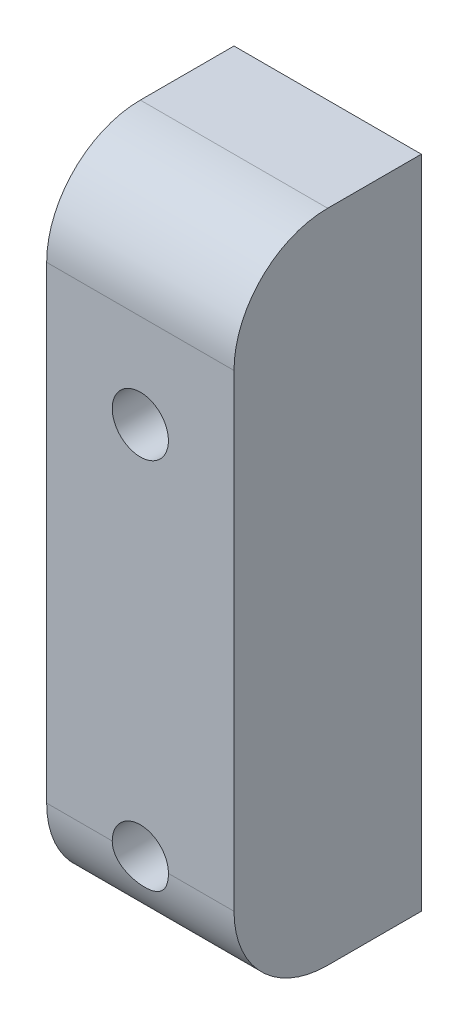
ISO-10303-21;
HEADER;
FILE_DESCRIPTION(('STEP AP214'),'2;1');
FILE_NAME('part.step','',(''),(''),'','','');
FILE_SCHEMA(('AUTOMOTIVE_DESIGN { 1 0 10303 214 1 1 1 1 }'));
ENDSEC;
DATA;
#1=APPLICATION_CONTEXT('core data for automotive mechanical design processes');
#2=APPLICATION_PROTOCOL_DEFINITION('international standard','automotive_design',2000,#1);
#3=PRODUCT_CONTEXT('',#1,'mechanical');
#4=PRODUCT('Part','Part','',(#3));
#5=PRODUCT_RELATED_PRODUCT_CATEGORY('part','',(#4));
#6=PRODUCT_DEFINITION_FORMATION('','',#4);
#7=PRODUCT_DEFINITION_CONTEXT('part definition',#1,'design');
#8=PRODUCT_DEFINITION('design','',#6,#7);
#9=PRODUCT_DEFINITION_SHAPE('','',#8);
#10=(LENGTH_UNIT() NAMED_UNIT(*) SI_UNIT(.MILLI.,.METRE.));
#11=(NAMED_UNIT(*) PLANE_ANGLE_UNIT() SI_UNIT($,.RADIAN.));
#12=(NAMED_UNIT(*) SI_UNIT($,.STERADIAN.) SOLID_ANGLE_UNIT());
#13=UNCERTAINTY_MEASURE_WITH_UNIT(LENGTH_MEASURE(1.E-05),#10,'distance_accuracy_value','');
#14=(GEOMETRIC_REPRESENTATION_CONTEXT(3) GLOBAL_UNCERTAINTY_ASSIGNED_CONTEXT((#13)) GLOBAL_UNIT_ASSIGNED_CONTEXT((#10,
#11,#12)) REPRESENTATION_CONTEXT('',''));
#15=CARTESIAN_POINT('',(0.,0.,0.));
#16=DIRECTION('',(0.,0.,1.));
#17=DIRECTION('',(1.,0.,0.));
#18=AXIS2_PLACEMENT_3D('',#15,#16,#17);
#19=CARTESIAN_POINT('',(0.,30.,5.));
#20=DIRECTION('',(1.,0.,0.));
#21=DIRECTION('',(0.,0.,-1.));
#22=AXIS2_PLACEMENT_3D('',#19,#20,#21);
#23=CYLINDRICAL_SURFACE('',#22,5.);
#24=DIRECTION('',(1.,0.,0.));
#25=VECTOR('',#24,1.);
#26=CARTESIAN_POINT('',(0.,35.,5.));
#27=LINE('',#26,#25);
#28=CARTESIAN_POINT('',(0.,35.,5.));
#29=VERTEX_POINT('',#28);
#30=CARTESIAN_POINT('',(10.,35.,5.));
#31=VERTEX_POINT('',#30);
#32=EDGE_CURVE('E185',#29,#31,#27,.T.);
#33=ORIENTED_EDGE('',*,*,#32,.F.);
#34=CARTESIAN_POINT('',(0.,30.,5.));
#35=DIRECTION('',(1.,0.,0.));
#36=DIRECTION('',(0.,0.,-1.));
#37=AXIS2_PLACEMENT_3D('',#34,#35,#36);
#38=CIRCLE('',#37,5.);
#39=CARTESIAN_POINT('',(0.,30.,10.));
#40=VERTEX_POINT('',#39);
#41=EDGE_CURVE('E39',#40,#29,#38,.F.);
#42=ORIENTED_EDGE('',*,*,#41,.F.);
#43=DIRECTION('',(1.,0.,0.));
#44=VECTOR('',#43,1.);
#45=CARTESIAN_POINT('',(0.,30.,10.));
#46=LINE('',#45,#44);
#47=CARTESIAN_POINT('',(10.,30.,10.));
#48=VERTEX_POINT('',#47);
#49=EDGE_CURVE('E186',#48,#40,#46,.F.);
#50=ORIENTED_EDGE('',*,*,#49,.F.);
#51=CARTESIAN_POINT('',(10.,30.,5.));
#52=DIRECTION('',(-1.,0.,0.));
#53=DIRECTION('',(0.,0.,1.));
#54=AXIS2_PLACEMENT_3D('',#51,#52,#53);
#55=CIRCLE('',#54,5.);
#56=EDGE_CURVE('E11',#31,#48,#55,.F.);
#57=ORIENTED_EDGE('',*,*,#56,.F.);
#58=EDGE_LOOP('',(#33,#42,#50,#57));
#59=FACE_BOUND('',#58,.T.);
#60=ADVANCED_FACE('F32',(#59),#23,.T.);
#61=CARTESIAN_POINT('',(0.,5.,5.));
#62=DIRECTION('',(-1.,0.,0.));
#63=DIRECTION('',(0.,0.,1.));
#64=AXIS2_PLACEMENT_3D('',#61,#62,#63);
#65=CYLINDRICAL_SURFACE('',#64,5.);
#66=DIRECTION('',(-1.,0.,0.));
#67=VECTOR('',#66,1.);
#68=CARTESIAN_POINT('',(0.,0.,5.));
#69=LINE('',#68,#67);
#70=CARTESIAN_POINT('',(10.,0.,5.));
#71=VERTEX_POINT('',#70);
#72=CARTESIAN_POINT('',(0.,0.,5.));
#73=VERTEX_POINT('',#72);
#74=EDGE_CURVE('E96',#71,#73,#69,.T.);
#75=ORIENTED_EDGE('',*,*,#74,.F.);
#76=CARTESIAN_POINT('',(10.,5.,5.));
#77=DIRECTION('',(-1.,0.,0.));
#78=DIRECTION('',(0.,0.,1.));
#79=AXIS2_PLACEMENT_3D('',#76,#77,#78);
#80=CIRCLE('',#79,5.);
#81=CARTESIAN_POINT('',(10.,5.,10.));
#82=VERTEX_POINT('',#81);
#83=EDGE_CURVE('E146',#82,#71,#80,.F.);
#84=ORIENTED_EDGE('',*,*,#83,.F.);
#85=DIRECTION('',(-1.,0.,0.));
#86=VECTOR('',#85,1.);
#87=CARTESIAN_POINT('',(0.,5.,10.));
#88=LINE('',#87,#86);
#89=CARTESIAN_POINT('',(6.5,5.,10.));
#90=VERTEX_POINT('',#89);
#91=EDGE_CURVE('E134',#90,#82,#88,.F.);
#92=ORIENTED_EDGE('',*,*,#91,.F.);
#93=CARTESIAN_POINT('',(3.5,5.,10.));
#94=CARTESIAN_POINT('',(3.49999925911617,4.95877831258963,10.0000027754024));
#95=CARTESIAN_POINT('',(3.50170032433893,4.91757722309338,9.99948961830437));
#96=CARTESIAN_POINT('',(3.50847984498363,4.83548679386837,9.99746104786987));
#97=CARTESIAN_POINT('',(3.51355763051422,4.79459739393209,9.99594583332714));
#98=CARTESIAN_POINT('',(3.53377381598598,4.67304209415784,9.98995421193134));
#99=CARTESIAN_POINT('',(3.5538954477311,4.59321745949932,9.98403144087443));
#100=CARTESIAN_POINT('',(3.60674329802549,4.438264258456,9.96895666966796));
#101=CARTESIAN_POINT('',(3.63946656840846,4.36313459845173,9.95980542486513));
#102=CARTESIAN_POINT('',(3.71652442758542,4.21939709935596,9.93922400440169));
#103=CARTESIAN_POINT('',(3.76086355559947,4.15079182416639,9.92779293825514));
#104=CARTESIAN_POINT('',(3.86122262004616,4.02012909441786,9.90350773319684));
#105=CARTESIAN_POINT('',(3.91751342878585,3.95828519024748,9.89062457487865));
#106=CARTESIAN_POINT('',(4.03960545916429,3.84475400840889,9.8650590629906));
#107=CARTESIAN_POINT('',(4.10540881767898,3.79306901898663,9.85237675525146));
#108=CARTESIAN_POINT('',(4.24647243696934,3.70019844337617,9.82834085488106));
#109=CARTESIAN_POINT('',(4.32191201582176,3.65927496465581,9.81702353512578));
#110=CARTESIAN_POINT('',(4.47899309538774,3.59078477229522,9.79743581318105));
#111=CARTESIAN_POINT('',(4.56063280863551,3.56321422585808,9.78916453682541));
#112=CARTESIAN_POINT('',(4.72538923609662,3.52298391002098,9.77690878515994));
#113=CARTESIAN_POINT('',(4.80840063946163,3.50992836625566,9.77281079616319));
#114=CARTESIAN_POINT('',(4.97553102437862,3.49786267118432,9.76902789052656));
#115=CARTESIAN_POINT('',(5.05964976156158,3.49884947122329,9.7693420159969));
#116=CARTESIAN_POINT('',(5.22338517560722,3.51453034932795,9.77424747859471));
#117=CARTESIAN_POINT('',(5.303054762561,3.52872839718331,9.77868402663893));
#118=CARTESIAN_POINT('',(5.4588221884981,3.56962663630021,9.79108381288695));
#119=CARTESIAN_POINT('',(5.53491978688837,3.59632766838076,9.79904728827279));
#120=CARTESIAN_POINT('',(5.68259739343233,3.66183842669431,9.81772695653105));
#121=CARTESIAN_POINT('',(5.75410139287707,3.70080874604825,9.82847930359409));
#122=CARTESIAN_POINT('',(5.88972691723586,3.78964378693866,9.85150889422316));
#123=CARTESIAN_POINT('',(5.95384605815982,3.83951201158264,9.8637866275724));
#124=CARTESIAN_POINT('',(6.07569172322632,3.95119224134118,9.88911125978566));
#125=CARTESIAN_POINT('',(6.13303886067696,4.01341645982347,9.9021688544726));
#126=CARTESIAN_POINT('',(6.23656226297909,4.14674916859541,9.92712458339037));
#127=CARTESIAN_POINT('',(6.28273981077309,4.21785663712808,9.93902285068807));
#128=CARTESIAN_POINT('',(6.36285820823387,4.36764296021206,9.96043111087851));
#129=CARTESIAN_POINT('',(6.39671438584704,4.446369666555,9.96992444667561));
#130=CARTESIAN_POINT('',(6.45059846427427,4.60874434291813,9.98533499215105));
#131=CARTESIAN_POINT('',(6.47062913558777,4.69239132331433,9.99125291827771));
#132=CARTESIAN_POINT('',(6.4956379312017,4.85897692871101,9.99867903231234));
#133=CARTESIAN_POINT('',(6.50114423261421,4.94182779259343,10.0003418851917));
#134=CARTESIAN_POINT('',(6.49912646964857,5.06591429865986,9.99973864059285));
#135=CARTESIAN_POINT('',(6.49673045210776,5.10730249145916,9.99901812439207));
#136=CARTESIAN_POINT('',(6.48853019338639,5.18971413808986,9.99656995848109));
#137=CARTESIAN_POINT('',(6.48272561867854,5.2307375558292,9.99484221021335));
#138=CARTESIAN_POINT('',(6.47523506704426,5.27144335866425,9.99262641332566));
#139=B_SPLINE_CURVE_WITH_KNOTS('',3,(#93,#94,#95,#96,#97,#98,#99,#100,#101,#102,#103,#104,#105,
#106,#107,#108,#109,#110,#111,#112,#113,#114,#115,#116,#117,#118,#119,#120,#121,#122,#123,#124,
#125,#126,#127,#128,#129,#130,#131,#132,#133,#134,#135,#136,#137,#138),.UNSPECIFIED.,.F.,.F.,(4,
2,2,2,2,2,2,2,2,2,2,2,2,2,2,2,2,2,2,2,2,2,4),(0.,0.123586356111995,0.247148201830571,
0.493467705939729,0.739729618322443,0.986087908329591,1.23877658661013,1.49152211672014,
1.74994861445845,2.00830088998418,2.25942146808874,2.51048752763582,2.75249171566257,
2.99451218067938,3.23984227495112,3.48525134634159,3.74092151898249,3.99656231130917,
4.25392809010995,4.5112422802811,4.75906134766254,4.88331836126863,5.0075875354491),.UNSPECIFIED.);
#140=CARTESIAN_POINT('',(3.5,5.,10.));
#141=VERTEX_POINT('',#140);
#142=EDGE_CURVE('E140',#141,#90,#139,.T.);
#143=ORIENTED_EDGE('',*,*,#142,.F.);
#144=DIRECTION('',(-1.,0.,0.));
#145=VECTOR('',#144,1.);
#146=CARTESIAN_POINT('',(0.,5.,10.));
#147=LINE('',#146,#145);
#148=CARTESIAN_POINT('',(0.,5.,10.));
#149=VERTEX_POINT('',#148);
#150=EDGE_CURVE('E137',#149,#141,#147,.F.);
#151=ORIENTED_EDGE('',*,*,#150,.F.);
#152=CARTESIAN_POINT('',(0.,5.,5.));
#153=DIRECTION('',(1.,0.,0.));
#154=DIRECTION('',(0.,0.,-1.));
#155=AXIS2_PLACEMENT_3D('',#152,#153,#154);
#156=CIRCLE('',#155,5.);
#157=EDGE_CURVE('E187',#73,#149,#156,.F.);
#158=ORIENTED_EDGE('',*,*,#157,.F.);
#159=EDGE_LOOP('',(#75,#84,#92,#143,#151,#158));
#160=FACE_BOUND('',#159,.T.);
#161=ADVANCED_FACE('F151',(#160),#65,.T.);
#162=CARTESIAN_POINT('',(0.,0.,10.));
#163=DIRECTION('',(0.,0.,-1.));
#164=DIRECTION('',(-1.,0.,0.));
#165=AXIS2_PLACEMENT_3D('',#162,#163,#164);
#166=PLANE('',#165);
#167=CARTESIAN_POINT('',(5.,25.,10.));
#168=DIRECTION('',(0.,0.,1.));
#169=DIRECTION('',(1.,0.,0.));
#170=AXIS2_PLACEMENT_3D('',#167,#168,#169);
#171=CIRCLE('',#170,1.5);
#172=CARTESIAN_POINT('',(6.5,25.,10.));
#173=VERTEX_POINT('',#172);
#174=EDGE_CURVE('E116',#173,#173,#171,.T.);
#175=ORIENTED_EDGE('',*,*,#174,.F.);
#176=EDGE_LOOP('',(#175));
#177=FACE_BOUND('',#176,.T.);
#178=DIRECTION('',(0.,1.,0.));
#179=VECTOR('',#178,1.);
#180=CARTESIAN_POINT('',(10.,0.,10.));
#181=LINE('',#180,#179);
#182=EDGE_CURVE('E122',#82,#48,#181,.T.);
#183=ORIENTED_EDGE('',*,*,#182,.T.);
#184=ORIENTED_EDGE('',*,*,#49,.T.);
#185=DIRECTION('',(0.,-1.,0.));
#186=VECTOR('',#185,1.);
#187=CARTESIAN_POINT('',(0.,0.,10.));
#188=LINE('',#187,#186);
#189=EDGE_CURVE('E128',#40,#149,#188,.T.);
#190=ORIENTED_EDGE('',*,*,#189,.T.);
#191=ORIENTED_EDGE('',*,*,#150,.T.);
#192=CARTESIAN_POINT('',(5.,5.,10.));
#193=DIRECTION('',(0.,0.,1.));
#194=DIRECTION('',(1.,0.,0.));
#195=AXIS2_PLACEMENT_3D('',#192,#193,#194);
#196=CIRCLE('',#195,1.5);
#197=EDGE_CURVE('E196',#90,#141,#196,.T.);
#198=ORIENTED_EDGE('',*,*,#197,.F.);
#199=ORIENTED_EDGE('',*,*,#91,.T.);
#200=EDGE_LOOP('',(#183,#184,#190,#191,#198,#199));
#201=FACE_BOUND('',#200,.T.);
#202=ADVANCED_FACE('F155',(#177,#201),#166,.F.);
#203=CARTESIAN_POINT('',(0.,0.,0.));
#204=DIRECTION('',(0.,0.,-1.));
#205=DIRECTION('',(-1.,0.,0.));
#206=AXIS2_PLACEMENT_3D('',#203,#204,#205);
#207=PLANE('',#206);
#208=CARTESIAN_POINT('',(5.,25.,0.));
#209=DIRECTION('',(0.,0.,1.));
#210=DIRECTION('',(1.,0.,0.));
#211=AXIS2_PLACEMENT_3D('',#208,#209,#210);
#212=CIRCLE('',#211,1.5);
#213=CARTESIAN_POINT('',(6.5,25.,0.));
#214=VERTEX_POINT('',#213);
#215=EDGE_CURVE('E119',#214,#214,#212,.T.);
#216=ORIENTED_EDGE('',*,*,#215,.T.);
#217=EDGE_LOOP('',(#216));
#218=FACE_BOUND('',#217,.T.);
#219=DIRECTION('',(0.,-1.,0.));
#220=VECTOR('',#219,1.);
#221=CARTESIAN_POINT('',(0.,0.,0.));
#222=LINE('',#221,#220);
#223=CARTESIAN_POINT('',(0.,35.,0.));
#224=VERTEX_POINT('',#223);
#225=CARTESIAN_POINT('',(0.,0.,0.));
#226=VERTEX_POINT('',#225);
#227=EDGE_CURVE('E107',#224,#226,#222,.T.);
#228=ORIENTED_EDGE('',*,*,#227,.F.);
#229=DIRECTION('',(-1.,0.,0.));
#230=VECTOR('',#229,1.);
#231=CARTESIAN_POINT('',(0.,35.,0.));
#232=LINE('',#231,#230);
#233=CARTESIAN_POINT('',(10.,35.,0.));
#234=VERTEX_POINT('',#233);
#235=EDGE_CURVE('E126',#234,#224,#232,.T.);
#236=ORIENTED_EDGE('',*,*,#235,.F.);
#237=DIRECTION('',(0.,1.,0.));
#238=VECTOR('',#237,1.);
#239=CARTESIAN_POINT('',(10.,0.,0.));
#240=LINE('',#239,#238);
#241=CARTESIAN_POINT('',(10.,0.,0.));
#242=VERTEX_POINT('',#241);
#243=EDGE_CURVE('E109',#242,#234,#240,.T.);
#244=ORIENTED_EDGE('',*,*,#243,.F.);
#245=DIRECTION('',(1.,0.,0.));
#246=VECTOR('',#245,1.);
#247=CARTESIAN_POINT('',(0.,0.,0.));
#248=LINE('',#247,#246);
#249=EDGE_CURVE('E93',#226,#242,#248,.T.);
#250=ORIENTED_EDGE('',*,*,#249,.F.);
#251=EDGE_LOOP('',(#228,#236,#244,#250));
#252=FACE_BOUND('',#251,.T.);
#253=CARTESIAN_POINT('',(5.,5.,0.));
#254=DIRECTION('',(0.,0.,1.));
#255=DIRECTION('',(1.,0.,0.));
#256=AXIS2_PLACEMENT_3D('',#253,#254,#255);
#257=CIRCLE('',#256,1.5);
#258=CARTESIAN_POINT('',(6.5,5.,0.));
#259=VERTEX_POINT('',#258);
#260=EDGE_CURVE('E198',#259,#259,#257,.T.);
#261=ORIENTED_EDGE('',*,*,#260,.T.);
#262=EDGE_LOOP('',(#261));
#263=FACE_BOUND('',#262,.T.);
#264=ADVANCED_FACE('F104',(#218,#252,#263),#207,.T.);
#265=CARTESIAN_POINT('',(0.,0.,10.));
#266=DIRECTION('',(1.,0.,0.));
#267=DIRECTION('',(0.,0.,-1.));
#268=AXIS2_PLACEMENT_3D('',#265,#266,#267);
#269=PLANE('',#268);
#270=ORIENTED_EDGE('',*,*,#189,.F.);
#271=ORIENTED_EDGE('',*,*,#41,.T.);
#272=DIRECTION('',(0.,0.,-1.));
#273=VECTOR('',#272,1.);
#274=CARTESIAN_POINT('',(0.,35.,10.));
#275=LINE('',#274,#273);
#276=EDGE_CURVE('E114',#29,#224,#275,.T.);
#277=ORIENTED_EDGE('',*,*,#276,.T.);
#278=ORIENTED_EDGE('',*,*,#227,.T.);
#279=DIRECTION('',(0.,0.,-1.));
#280=VECTOR('',#279,1.);
#281=CARTESIAN_POINT('',(0.,0.,10.));
#282=LINE('',#281,#280);
#283=EDGE_CURVE('E89',#73,#226,#282,.T.);
#284=ORIENTED_EDGE('',*,*,#283,.F.);
#285=ORIENTED_EDGE('',*,*,#157,.T.);
#286=EDGE_LOOP('',(#270,#271,#277,#278,#284,#285));
#287=FACE_BOUND('',#286,.T.);
#288=ADVANCED_FACE('F112',(#287),#269,.F.);
#289=CARTESIAN_POINT('',(0.,0.,10.));
#290=DIRECTION('',(0.,1.,0.));
#291=DIRECTION('',(0.,0.,1.));
#292=AXIS2_PLACEMENT_3D('',#289,#290,#291);
#293=PLANE('',#292);
#294=DIRECTION('',(0.,0.,-1.));
#295=VECTOR('',#294,1.);
#296=CARTESIAN_POINT('',(10.,0.,10.));
#297=LINE('',#296,#295);
#298=EDGE_CURVE('E100',#71,#242,#297,.T.);
#299=ORIENTED_EDGE('',*,*,#298,.F.);
#300=ORIENTED_EDGE('',*,*,#74,.T.);
#301=ORIENTED_EDGE('',*,*,#283,.T.);
#302=ORIENTED_EDGE('',*,*,#249,.T.);
#303=EDGE_LOOP('',(#299,#300,#301,#302));
#304=FACE_BOUND('',#303,.T.);
#305=ADVANCED_FACE('F92',(#304),#293,.F.);
#306=CARTESIAN_POINT('',(10.,0.,10.));
#307=DIRECTION('',(-1.,0.,0.));
#308=DIRECTION('',(0.,0.,1.));
#309=AXIS2_PLACEMENT_3D('',#306,#307,#308);
#310=PLANE('',#309);
#311=DIRECTION('',(0.,0.,-1.));
#312=VECTOR('',#311,1.);
#313=CARTESIAN_POINT('',(10.,35.,10.));
#314=LINE('',#313,#312);
#315=EDGE_CURVE('E130',#31,#234,#314,.T.);
#316=ORIENTED_EDGE('',*,*,#315,.F.);
#317=ORIENTED_EDGE('',*,*,#56,.T.);
#318=ORIENTED_EDGE('',*,*,#182,.F.);
#319=ORIENTED_EDGE('',*,*,#83,.T.);
#320=ORIENTED_EDGE('',*,*,#298,.T.);
#321=ORIENTED_EDGE('',*,*,#243,.T.);
#322=EDGE_LOOP('',(#316,#317,#318,#319,#320,#321));
#323=FACE_BOUND('',#322,.T.);
#324=ADVANCED_FACE('F161',(#323),#310,.F.);
#325=CARTESIAN_POINT('',(0.,35.,10.));
#326=DIRECTION('',(0.,-1.,0.));
#327=DIRECTION('',(0.,0.,-1.));
#328=AXIS2_PLACEMENT_3D('',#325,#326,#327);
#329=PLANE('',#328);
#330=ORIENTED_EDGE('',*,*,#276,.F.);
#331=ORIENTED_EDGE('',*,*,#32,.T.);
#332=ORIENTED_EDGE('',*,*,#315,.T.);
#333=ORIENTED_EDGE('',*,*,#235,.T.);
#334=EDGE_LOOP('',(#330,#331,#332,#333));
#335=FACE_BOUND('',#334,.T.);
#336=ADVANCED_FACE('F164',(#335),#329,.F.);
#337=CARTESIAN_POINT('',(5.,25.,10.));
#338=DIRECTION('',(0.,0.,-1.));
#339=DIRECTION('',(-1.,0.,0.));
#340=AXIS2_PLACEMENT_3D('',#337,#338,#339);
#341=CYLINDRICAL_SURFACE('',#340,1.5);
#342=ORIENTED_EDGE('',*,*,#174,.T.);
#343=EDGE_LOOP('',(#342));
#344=FACE_BOUND('',#343,.T.);
#345=ORIENTED_EDGE('',*,*,#215,.F.);
#346=EDGE_LOOP('',(#345));
#347=FACE_BOUND('',#346,.T.);
#348=ADVANCED_FACE('F167',(#344,#347),#341,.F.);
#349=CARTESIAN_POINT('',(5.,5.,10.));
#350=DIRECTION('',(0.,0.,-1.));
#351=DIRECTION('',(-1.,0.,0.));
#352=AXIS2_PLACEMENT_3D('',#349,#350,#351);
#353=CYLINDRICAL_SURFACE('',#352,1.5);
#354=ORIENTED_EDGE('',*,*,#197,.T.);
#355=ORIENTED_EDGE('',*,*,#142,.T.);
#356=EDGE_LOOP('',(#354,#355));
#357=FACE_BOUND('',#356,.T.);
#358=ORIENTED_EDGE('',*,*,#260,.F.);
#359=EDGE_LOOP('',(#358));
#360=FACE_BOUND('',#359,.T.);
#361=ADVANCED_FACE('F148',(#357,#360),#353,.F.);
#362=CLOSED_SHELL('',(#60,#161,#202,#264,#288,#305,#324,#336,#348,#361));
#363=MANIFOLD_SOLID_BREP('B2',#362);
#364=ADVANCED_BREP_SHAPE_REPRESENTATION('',(#18,#363),#14);
#365=SHAPE_DEFINITION_REPRESENTATION(#9,#364);
ENDSEC;
END-ISO-10303-21;
